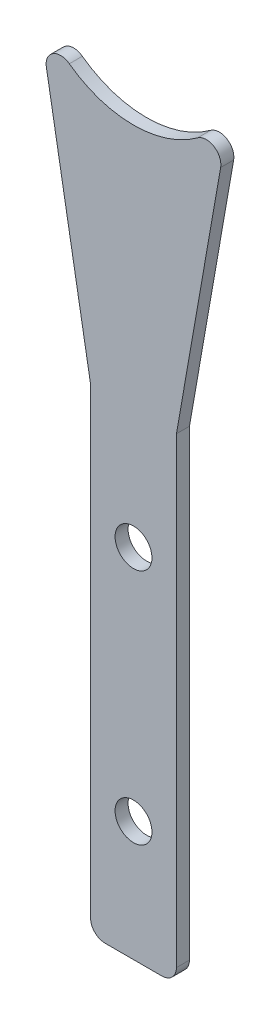
ISO-10303-21;
HEADER;
FILE_DESCRIPTION(('STEP AP214'),'2;1');
FILE_NAME('part.step','',(''),(''),'','','');
FILE_SCHEMA(('AUTOMOTIVE_DESIGN { 1 0 10303 214 1 1 1 1 }'));
ENDSEC;
DATA;
#1=APPLICATION_CONTEXT('core data for automotive mechanical design processes');
#2=APPLICATION_PROTOCOL_DEFINITION('international standard','automotive_design',2000,#1);
#3=PRODUCT_CONTEXT('',#1,'mechanical');
#4=PRODUCT('Part','Part','',(#3));
#5=PRODUCT_RELATED_PRODUCT_CATEGORY('part','',(#4));
#6=PRODUCT_DEFINITION_FORMATION('','',#4);
#7=PRODUCT_DEFINITION_CONTEXT('part definition',#1,'design');
#8=PRODUCT_DEFINITION('design','',#6,#7);
#9=PRODUCT_DEFINITION_SHAPE('','',#8);
#10=(LENGTH_UNIT() NAMED_UNIT(*) SI_UNIT(.MILLI.,.METRE.));
#11=(NAMED_UNIT(*) PLANE_ANGLE_UNIT() SI_UNIT($,.RADIAN.));
#12=(NAMED_UNIT(*) SI_UNIT($,.STERADIAN.) SOLID_ANGLE_UNIT());
#13=UNCERTAINTY_MEASURE_WITH_UNIT(LENGTH_MEASURE(1.E-05),#10,'distance_accuracy_value','');
#14=(GEOMETRIC_REPRESENTATION_CONTEXT(3) GLOBAL_UNCERTAINTY_ASSIGNED_CONTEXT((#13)) GLOBAL_UNIT_ASSIGNED_CONTEXT((#10,
#11,#12)) REPRESENTATION_CONTEXT('',''));
#15=CARTESIAN_POINT('',(0.,0.,0.));
#16=DIRECTION('',(0.,0.,1.));
#17=DIRECTION('',(1.,0.,0.));
#18=AXIS2_PLACEMENT_3D('',#15,#16,#17);
#19=CARTESIAN_POINT('',(-3.07892409853893,0.,1.5875));
#20=DIRECTION('',(-1.,0.,0.));
#21=DIRECTION('',(0.,0.,1.));
#22=AXIS2_PLACEMENT_3D('',#19,#20,#21);
#23=PLANE('',#22);
#24=DIRECTION('',(0.,1.,0.));
#25=VECTOR('',#24,1.);
#26=CARTESIAN_POINT('',(-3.07892409853893,0.,0.));
#27=LINE('',#26,#25);
#28=CARTESIAN_POINT('',(-3.07892409853893,-26.8398665511832,0.));
#29=VERTEX_POINT('',#28);
#30=CARTESIAN_POINT('',(-3.07892409853893,29.5681257650785,0.));
#31=VERTEX_POINT('',#30);
#32=EDGE_CURVE('E148',#29,#31,#27,.T.);
#33=ORIENTED_EDGE('',*,*,#32,.F.);
#34=DIRECTION('',(0.,0.,-1.));
#35=VECTOR('',#34,1.);
#36=CARTESIAN_POINT('',(-3.07892409853893,-26.8398665511832,1.5875));
#37=LINE('',#36,#35);
#38=CARTESIAN_POINT('',(-3.07892409853893,-26.8398665511832,1.5875));
#39=VERTEX_POINT('',#38);
#40=EDGE_CURVE('E185',#29,#39,#37,.F.);
#41=ORIENTED_EDGE('',*,*,#40,.T.);
#42=DIRECTION('',(0.,1.,0.));
#43=VECTOR('',#42,1.);
#44=CARTESIAN_POINT('',(-3.07892409853893,0.,1.5875));
#45=LINE('',#44,#43);
#46=CARTESIAN_POINT('',(-3.07892409853893,29.5681257650785,1.5875));
#47=VERTEX_POINT('',#46);
#48=EDGE_CURVE('E163',#39,#47,#45,.T.);
#49=ORIENTED_EDGE('',*,*,#48,.T.);
#50=DIRECTION('',(0.,0.,-1.));
#51=VECTOR('',#50,1.);
#52=CARTESIAN_POINT('',(-3.07892409853893,29.5681257650785,1.5875));
#53=LINE('',#52,#51);
#54=EDGE_CURVE('E137',#47,#31,#53,.T.);
#55=ORIENTED_EDGE('',*,*,#54,.T.);
#56=EDGE_LOOP('',(#33,#41,#49,#55));
#57=FACE_BOUND('',#56,.T.);
#58=ADVANCED_FACE('F39',(#57),#23,.T.);
#59=CARTESIAN_POINT('',(0.,-28.6178665511832,1.5875));
#60=DIRECTION('',(0.,1.,0.));
#61=DIRECTION('',(0.,0.,1.));
#62=AXIS2_PLACEMENT_3D('',#59,#60,#61);
#63=PLANE('',#62);
#64=DIRECTION('',(1.,0.,0.));
#65=VECTOR('',#64,1.);
#66=CARTESIAN_POINT('',(0.,-28.6178665511832,0.));
#67=LINE('',#66,#65);
#68=CARTESIAN_POINT('',(-1.30092409853893,-28.6178665511832,0.));
#69=VERTEX_POINT('',#68);
#70=CARTESIAN_POINT('',(5.6205080148772,-28.6178665511832,0.));
#71=VERTEX_POINT('',#70);
#72=EDGE_CURVE('E150',#69,#71,#67,.T.);
#73=ORIENTED_EDGE('',*,*,#72,.T.);
#74=DIRECTION('',(0.,0.,-1.));
#75=VECTOR('',#74,1.);
#76=CARTESIAN_POINT('',(5.6205080148772,-28.6178665511832,1.5875));
#77=LINE('',#76,#75);
#78=CARTESIAN_POINT('',(5.6205080148772,-28.6178665511832,1.5875));
#79=VERTEX_POINT('',#78);
#80=EDGE_CURVE('E178',#71,#79,#77,.F.);
#81=ORIENTED_EDGE('',*,*,#80,.T.);
#82=DIRECTION('',(1.,0.,0.));
#83=VECTOR('',#82,1.);
#84=CARTESIAN_POINT('',(0.,-28.6178665511832,1.5875));
#85=LINE('',#84,#83);
#86=CARTESIAN_POINT('',(-1.30092409853893,-28.6178665511832,1.5875));
#87=VERTEX_POINT('',#86);
#88=EDGE_CURVE('E126',#87,#79,#85,.T.);
#89=ORIENTED_EDGE('',*,*,#88,.F.);
#90=DIRECTION('',(0.,0.,-1.));
#91=VECTOR('',#90,1.);
#92=CARTESIAN_POINT('',(-1.30092409853893,-28.6178665511832,0.));
#93=LINE('',#92,#91);
#94=EDGE_CURVE('E175',#87,#69,#93,.T.);
#95=ORIENTED_EDGE('',*,*,#94,.T.);
#96=EDGE_LOOP('',(#73,#81,#89,#95));
#97=FACE_BOUND('',#96,.T.);
#98=ADVANCED_FACE('F218',(#97),#63,.F.);
#99=CARTESIAN_POINT('',(7.3985080148772,0.,1.5875));
#100=DIRECTION('',(-1.,0.,0.));
#101=DIRECTION('',(0.,0.,1.));
#102=AXIS2_PLACEMENT_3D('',#99,#100,#101);
#103=PLANE('',#102);
#104=DIRECTION('',(0.,1.,0.));
#105=VECTOR('',#104,1.);
#106=CARTESIAN_POINT('',(7.3985080148772,0.,1.5875));
#107=LINE('',#106,#105);
#108=CARTESIAN_POINT('',(7.3985080148772,-26.8398665511832,1.5875));
#109=VERTEX_POINT('',#108);
#110=CARTESIAN_POINT('',(7.3985080148772,29.5681257650785,1.5875));
#111=VERTEX_POINT('',#110);
#112=EDGE_CURVE('E115',#109,#111,#107,.T.);
#113=ORIENTED_EDGE('',*,*,#112,.F.);
#114=DIRECTION('',(0.,0.,-1.));
#115=VECTOR('',#114,1.);
#116=CARTESIAN_POINT('',(7.3985080148772,-26.8398665511832,1.5875));
#117=LINE('',#116,#115);
#118=CARTESIAN_POINT('',(7.3985080148772,-26.8398665511832,0.));
#119=VERTEX_POINT('',#118);
#120=EDGE_CURVE('E136',#109,#119,#117,.T.);
#121=ORIENTED_EDGE('',*,*,#120,.T.);
#122=DIRECTION('',(0.,1.,0.));
#123=VECTOR('',#122,1.);
#124=CARTESIAN_POINT('',(7.3985080148772,0.,0.));
#125=LINE('',#124,#123);
#126=CARTESIAN_POINT('',(7.3985080148772,29.5681257650785,0.));
#127=VERTEX_POINT('',#126);
#128=EDGE_CURVE('E132',#119,#127,#125,.T.);
#129=ORIENTED_EDGE('',*,*,#128,.T.);
#130=DIRECTION('',(0.,0.,-1.));
#131=VECTOR('',#130,1.);
#132=CARTESIAN_POINT('',(7.3985080148772,29.5681257650785,1.5875));
#133=LINE('',#132,#131);
#134=EDGE_CURVE('E129',#111,#127,#133,.T.);
#135=ORIENTED_EDGE('',*,*,#134,.F.);
#136=EDGE_LOOP('',(#113,#121,#129,#135));
#137=FACE_BOUND('',#136,.T.);
#138=ADVANCED_FACE('F130',(#137),#103,.F.);
#139=CARTESIAN_POINT('',(2.16060054386414,-0.377913935984634,1.5875));
#140=DIRECTION('',(-0.985045261909091,0.172295768927885,0.));
#141=DIRECTION('',(-0.172295768927885,-0.985045261909091,0.));
#142=AXIS2_PLACEMENT_3D('',#139,#140,#141);
#143=PLANE('',#142);
#144=DIRECTION('',(0.172295768927885,0.985045261909091,0.));
#145=VECTOR('',#144,1.);
#146=CARTESIAN_POINT('',(2.16060054386414,-0.377913935984634,0.));
#147=LINE('',#146,#145);
#148=CARTESIAN_POINT('',(12.791159192441,60.398862495538,0.));
#149=VERTEX_POINT('',#148);
#150=EDGE_CURVE('E155',#127,#149,#147,.T.);
#151=ORIENTED_EDGE('',*,*,#150,.T.);
#152=DIRECTION('',(0.,0.,1.));
#153=VECTOR('',#152,1.);
#154=CARTESIAN_POINT('',(12.791159192441,60.398862495538,1.5875));
#155=LINE('',#154,#153);
#156=CARTESIAN_POINT('',(12.791159192441,60.398862495538,1.5875));
#157=VERTEX_POINT('',#156);
#158=EDGE_CURVE('E11',#149,#157,#155,.T.);
#159=ORIENTED_EDGE('',*,*,#158,.T.);
#160=DIRECTION('',(0.172295768927885,0.985045261909091,0.));
#161=VECTOR('',#160,1.);
#162=CARTESIAN_POINT('',(2.16060054386414,-0.377913935984634,1.5875));
#163=LINE('',#162,#161);
#164=EDGE_CURVE('E120',#111,#157,#163,.T.);
#165=ORIENTED_EDGE('',*,*,#164,.F.);
#166=ORIENTED_EDGE('',*,*,#134,.T.);
#167=EDGE_LOOP('',(#151,#159,#165,#166));
#168=FACE_BOUND('',#167,.T.);
#169=ADVANCED_FACE('F139',(#168),#143,.F.);
#170=CARTESIAN_POINT('',(2.15804198213946,72.7781257043364,1.5875));
#171=DIRECTION('',(0.,0.,-1.));
#172=DIRECTION('',(-1.,0.,0.));
#173=AXIS2_PLACEMENT_3D('',#170,#171,#172);
#174=CYLINDRICAL_SURFACE('',#173,13.21);
#175=CARTESIAN_POINT('',(2.15804198213946,72.7781257043364,0.));
#176=DIRECTION('',(0.,0.,1.));
#177=DIRECTION('',(1.,0.,0.));
#178=AXIS2_PLACEMENT_3D('',#175,#176,#177);
#179=CIRCLE('',#178,13.21);
#180=CARTESIAN_POINT('',(-5.66944118675006,62.1369506169341,0.));
#181=VERTEX_POINT('',#180);
#182=CARTESIAN_POINT('',(9.98612751486066,62.1373937326908,0.));
#183=VERTEX_POINT('',#182);
#184=EDGE_CURVE('E157',#181,#183,#179,.T.);
#185=ORIENTED_EDGE('',*,*,#184,.F.);
#186=DIRECTION('',(0.,0.,-1.));
#187=VECTOR('',#186,1.);
#188=CARTESIAN_POINT('',(-5.66944118675006,62.1369506169341,1.5875));
#189=LINE('',#188,#187);
#190=CARTESIAN_POINT('',(-5.66944118675006,62.1369506169341,1.5875));
#191=VERTEX_POINT('',#190);
#192=EDGE_CURVE('E47',#181,#191,#189,.F.);
#193=ORIENTED_EDGE('',*,*,#192,.T.);
#194=CARTESIAN_POINT('',(2.15804198213946,72.7781257043364,1.5875));
#195=DIRECTION('',(0.,0.,1.));
#196=DIRECTION('',(1.,0.,0.));
#197=AXIS2_PLACEMENT_3D('',#194,#195,#196);
#198=CIRCLE('',#197,13.21);
#199=CARTESIAN_POINT('',(9.98612751486066,62.1373937326908,1.5875));
#200=VERTEX_POINT('',#199);
#201=EDGE_CURVE('E141',#191,#200,#198,.T.);
#202=ORIENTED_EDGE('',*,*,#201,.T.);
#203=DIRECTION('',(0.,0.,-1.));
#204=VECTOR('',#203,1.);
#205=CARTESIAN_POINT('',(9.98612751486066,62.1373937326908,1.5875));
#206=LINE('',#205,#204);
#207=EDGE_CURVE('E190',#200,#183,#206,.T.);
#208=ORIENTED_EDGE('',*,*,#207,.T.);
#209=EDGE_LOOP('',(#185,#193,#202,#208));
#210=FACE_BOUND('',#209,.T.);
#211=ADVANCED_FACE('F195',(#210),#174,.F.);
#212=CARTESIAN_POINT('',(2.03339075524222,0.35585503979909,1.5875));
#213=DIRECTION('',(-0.985029508234318,-0.172385811213273,0.));
#214=DIRECTION('',(0.172385811213273,-0.985029508234318,0.));
#215=AXIS2_PLACEMENT_3D('',#212,#213,#214);
#216=PLANE('',#215);
#217=DIRECTION('',(-0.172385811213273,0.985029508234318,0.));
#218=VECTOR('',#217,1.);
#219=CARTESIAN_POINT('',(2.03339075524222,0.35585503979909,1.5875));
#220=LINE('',#219,#218);
#221=CARTESIAN_POINT('',(-8.47436377913447,60.398199643431,1.5875));
#222=VERTEX_POINT('',#221);
#223=EDGE_CURVE('E143',#47,#222,#220,.T.);
#224=ORIENTED_EDGE('',*,*,#223,.T.);
#225=DIRECTION('',(0.,0.,-1.));
#226=VECTOR('',#225,1.);
#227=CARTESIAN_POINT('',(-8.47436377913447,60.398199643431,1.5875));
#228=LINE('',#227,#226);
#229=CARTESIAN_POINT('',(-8.47436377913447,60.398199643431,0.));
#230=VERTEX_POINT('',#229);
#231=EDGE_CURVE('E187',#222,#230,#228,.T.);
#232=ORIENTED_EDGE('',*,*,#231,.T.);
#233=DIRECTION('',(-0.172385811213273,0.985029508234318,0.));
#234=VECTOR('',#233,1.);
#235=CARTESIAN_POINT('',(2.03339075524222,0.35585503979909,0.));
#236=LINE('',#235,#234);
#237=EDGE_CURVE('E160',#31,#230,#236,.T.);
#238=ORIENTED_EDGE('',*,*,#237,.F.);
#239=ORIENTED_EDGE('',*,*,#54,.F.);
#240=EDGE_LOOP('',(#224,#232,#238,#239));
#241=FACE_BOUND('',#240,.T.);
#242=ADVANCED_FACE('F202',(#241),#216,.T.);
#243=CARTESIAN_POINT('',(0.,0.,1.5875));
#244=DIRECTION('',(0.,0.,1.));
#245=DIRECTION('',(1.,0.,0.));
#246=AXIS2_PLACEMENT_3D('',#243,#244,#245);
#247=PLANE('',#246);
#248=CARTESIAN_POINT('',(2.1599510468991,14.9571257688168,1.5875));
#249=DIRECTION('',(0.,0.,1.));
#250=DIRECTION('',(1.,0.,0.));
#251=AXIS2_PLACEMENT_3D('',#248,#249,#250);
#252=CIRCLE('',#251,2.24999999999999);
#253=CARTESIAN_POINT('',(4.40995104689909,14.9571257688168,1.5875));
#254=VERTEX_POINT('',#253);
#255=EDGE_CURVE('E231',#254,#254,#252,.T.);
#256=ORIENTED_EDGE('',*,*,#255,.F.);
#257=EDGE_LOOP('',(#256));
#258=FACE_BOUND('',#257,.T.);
#259=CARTESIAN_POINT('',(2.15995104689911,-14.0068665511832,1.5875));
#260=DIRECTION('',(0.,0.,1.));
#261=DIRECTION('',(1.,0.,0.));
#262=AXIS2_PLACEMENT_3D('',#259,#260,#261);
#263=CIRCLE('',#262,2.24999999999999);
#264=CARTESIAN_POINT('',(4.4099510468991,-14.0068665511832,1.5875));
#265=VERTEX_POINT('',#264);
#266=EDGE_CURVE('E225',#265,#265,#263,.T.);
#267=ORIENTED_EDGE('',*,*,#266,.F.);
#268=EDGE_LOOP('',(#267));
#269=FACE_BOUND('',#268,.T.);
#270=ORIENTED_EDGE('',*,*,#88,.T.);
#271=CARTESIAN_POINT('',(5.6205080148772,-26.8398665511832,1.5875));
#272=DIRECTION('',(0.,0.,1.));
#273=DIRECTION('',(1.,0.,0.));
#274=AXIS2_PLACEMENT_3D('',#271,#272,#273);
#275=CIRCLE('',#274,1.778);
#276=EDGE_CURVE('E122',#79,#109,#275,.T.);
#277=ORIENTED_EDGE('',*,*,#276,.T.);
#278=ORIENTED_EDGE('',*,*,#112,.T.);
#279=ORIENTED_EDGE('',*,*,#164,.T.);
#280=CARTESIAN_POINT('',(11.0397487167667,60.7052043726918,1.5875));
#281=DIRECTION('',(0.,0.,1.));
#282=DIRECTION('',(1.,0.,0.));
#283=AXIS2_PLACEMENT_3D('',#280,#281,#282);
#284=CIRCLE('',#283,1.778);
#285=EDGE_CURVE('E60',#157,#200,#284,.T.);
#286=ORIENTED_EDGE('',*,*,#285,.T.);
#287=ORIENTED_EDGE('',*,*,#201,.F.);
#288=CARTESIAN_POINT('',(-6.72298131349385,60.7047016157682,1.5875));
#289=DIRECTION('',(0.,0.,1.));
#290=DIRECTION('',(1.,0.,0.));
#291=AXIS2_PLACEMENT_3D('',#288,#289,#290);
#292=CIRCLE('',#291,1.778);
#293=EDGE_CURVE('E54',#191,#222,#292,.T.);
#294=ORIENTED_EDGE('',*,*,#293,.T.);
#295=ORIENTED_EDGE('',*,*,#223,.F.);
#296=ORIENTED_EDGE('',*,*,#48,.F.);
#297=CARTESIAN_POINT('',(-1.30092409853893,-26.8398665511832,1.5875));
#298=DIRECTION('',(0.,0.,1.));
#299=DIRECTION('',(1.,0.,0.));
#300=AXIS2_PLACEMENT_3D('',#297,#298,#299);
#301=CIRCLE('',#300,1.778);
#302=EDGE_CURVE('E182',#39,#87,#301,.T.);
#303=ORIENTED_EDGE('',*,*,#302,.T.);
#304=EDGE_LOOP('',(#270,#277,#278,#279,#286,#287,#294,#295,#296,#303));
#305=FACE_BOUND('',#304,.T.);
#306=ADVANCED_FACE('F118',(#258,#269,#305),#247,.T.);
#307=CARTESIAN_POINT('',(0.,0.,0.));
#308=DIRECTION('',(0.,0.,1.));
#309=DIRECTION('',(1.,0.,0.));
#310=AXIS2_PLACEMENT_3D('',#307,#308,#309);
#311=PLANE('',#310);
#312=CARTESIAN_POINT('',(2.1599510468991,14.9571257688168,0.));
#313=DIRECTION('',(0.,0.,1.));
#314=DIRECTION('',(1.,0.,0.));
#315=AXIS2_PLACEMENT_3D('',#312,#313,#314);
#316=CIRCLE('',#315,2.25);
#317=CARTESIAN_POINT('',(4.4099510468991,14.9571257688168,0.));
#318=VERTEX_POINT('',#317);
#319=EDGE_CURVE('E228',#318,#318,#316,.T.);
#320=ORIENTED_EDGE('',*,*,#319,.T.);
#321=EDGE_LOOP('',(#320));
#322=FACE_BOUND('',#321,.T.);
#323=CARTESIAN_POINT('',(2.15995104689911,-14.0068665511832,0.));
#324=DIRECTION('',(0.,0.,1.));
#325=DIRECTION('',(1.,0.,0.));
#326=AXIS2_PLACEMENT_3D('',#323,#324,#325);
#327=CIRCLE('',#326,2.25);
#328=CARTESIAN_POINT('',(4.40995104689911,-14.0068665511832,0.));
#329=VERTEX_POINT('',#328);
#330=EDGE_CURVE('E151',#329,#329,#327,.T.);
#331=ORIENTED_EDGE('',*,*,#330,.T.);
#332=EDGE_LOOP('',(#331));
#333=FACE_BOUND('',#332,.T.);
#334=ORIENTED_EDGE('',*,*,#128,.F.);
#335=CARTESIAN_POINT('',(5.6205080148772,-26.8398665511832,0.));
#336=DIRECTION('',(0.,0.,1.));
#337=DIRECTION('',(1.,0.,0.));
#338=AXIS2_PLACEMENT_3D('',#335,#336,#337);
#339=CIRCLE('',#338,1.778);
#340=EDGE_CURVE('E173',#119,#71,#339,.F.);
#341=ORIENTED_EDGE('',*,*,#340,.T.);
#342=ORIENTED_EDGE('',*,*,#72,.F.);
#343=CARTESIAN_POINT('',(-1.30092409853893,-26.8398665511832,0.));
#344=DIRECTION('',(0.,0.,1.));
#345=DIRECTION('',(1.,0.,0.));
#346=AXIS2_PLACEMENT_3D('',#343,#344,#345);
#347=CIRCLE('',#346,1.778);
#348=EDGE_CURVE('E171',#69,#29,#347,.F.);
#349=ORIENTED_EDGE('',*,*,#348,.T.);
#350=ORIENTED_EDGE('',*,*,#32,.T.);
#351=ORIENTED_EDGE('',*,*,#237,.T.);
#352=CARTESIAN_POINT('',(-6.72298131349385,60.7047016157682,0.));
#353=DIRECTION('',(0.,0.,1.));
#354=DIRECTION('',(1.,0.,0.));
#355=AXIS2_PLACEMENT_3D('',#352,#353,#354);
#356=CIRCLE('',#355,1.778);
#357=EDGE_CURVE('E169',#230,#181,#356,.F.);
#358=ORIENTED_EDGE('',*,*,#357,.T.);
#359=ORIENTED_EDGE('',*,*,#184,.T.);
#360=CARTESIAN_POINT('',(11.0397487167667,60.7052043726918,0.));
#361=DIRECTION('',(0.,0.,1.));
#362=DIRECTION('',(1.,0.,0.));
#363=AXIS2_PLACEMENT_3D('',#360,#361,#362);
#364=CIRCLE('',#363,1.778);
#365=EDGE_CURVE('E167',#183,#149,#364,.F.);
#366=ORIENTED_EDGE('',*,*,#365,.T.);
#367=ORIENTED_EDGE('',*,*,#150,.F.);
#368=EDGE_LOOP('',(#334,#341,#342,#349,#350,#351,#358,#359,#366,#367));
#369=FACE_BOUND('',#368,.T.);
#370=ADVANCED_FACE('F205',(#322,#333,#369),#311,.F.);
#371=CARTESIAN_POINT('',(5.6205080148772,-26.8398665511832,1.5875));
#372=DIRECTION('',(0.,0.,-1.));
#373=DIRECTION('',(-1.,0.,0.));
#374=AXIS2_PLACEMENT_3D('',#371,#372,#373);
#375=CYLINDRICAL_SURFACE('',#374,1.778);
#376=ORIENTED_EDGE('',*,*,#276,.F.);
#377=ORIENTED_EDGE('',*,*,#80,.F.);
#378=ORIENTED_EDGE('',*,*,#340,.F.);
#379=ORIENTED_EDGE('',*,*,#120,.F.);
#380=EDGE_LOOP('',(#376,#377,#378,#379));
#381=FACE_BOUND('',#380,.T.);
#382=ADVANCED_FACE('F221',(#381),#375,.T.);
#383=CARTESIAN_POINT('',(-1.30092409853893,-26.8398665511832,1.5875));
#384=DIRECTION('',(0.,0.,1.));
#385=DIRECTION('',(1.,0.,0.));
#386=AXIS2_PLACEMENT_3D('',#383,#384,#385);
#387=CYLINDRICAL_SURFACE('',#386,1.778);
#388=ORIENTED_EDGE('',*,*,#302,.F.);
#389=ORIENTED_EDGE('',*,*,#40,.F.);
#390=ORIENTED_EDGE('',*,*,#348,.F.);
#391=ORIENTED_EDGE('',*,*,#94,.F.);
#392=EDGE_LOOP('',(#388,#389,#390,#391));
#393=FACE_BOUND('',#392,.T.);
#394=ADVANCED_FACE('F216',(#393),#387,.T.);
#395=CARTESIAN_POINT('',(-6.72298131349385,60.7047016157682,1.5875));
#396=DIRECTION('',(0.,0.,-1.));
#397=DIRECTION('',(-1.,0.,0.));
#398=AXIS2_PLACEMENT_3D('',#395,#396,#397);
#399=CYLINDRICAL_SURFACE('',#398,1.778);
#400=ORIENTED_EDGE('',*,*,#293,.F.);
#401=ORIENTED_EDGE('',*,*,#192,.F.);
#402=ORIENTED_EDGE('',*,*,#357,.F.);
#403=ORIENTED_EDGE('',*,*,#231,.F.);
#404=EDGE_LOOP('',(#400,#401,#402,#403));
#405=FACE_BOUND('',#404,.T.);
#406=ADVANCED_FACE('F199',(#405),#399,.T.);
#407=CARTESIAN_POINT('',(11.0397487167667,60.7052043726918,1.5875));
#408=DIRECTION('',(0.,0.,-1.));
#409=DIRECTION('',(-1.,0.,0.));
#410=AXIS2_PLACEMENT_3D('',#407,#408,#409);
#411=CYLINDRICAL_SURFACE('',#410,1.778);
#412=ORIENTED_EDGE('',*,*,#285,.F.);
#413=ORIENTED_EDGE('',*,*,#158,.F.);
#414=ORIENTED_EDGE('',*,*,#365,.F.);
#415=ORIENTED_EDGE('',*,*,#207,.F.);
#416=EDGE_LOOP('',(#412,#413,#414,#415));
#417=FACE_BOUND('',#416,.T.);
#418=ADVANCED_FACE('F41',(#417),#411,.T.);
#419=CARTESIAN_POINT('',(2.15995104689911,-14.0068665511832,1.5875));
#420=DIRECTION('',(0.,0.,1.));
#421=DIRECTION('',(1.,0.,0.));
#422=AXIS2_PLACEMENT_3D('',#419,#420,#421);
#423=CYLINDRICAL_SURFACE('',#422,2.24999999999999);
#424=ORIENTED_EDGE('',*,*,#330,.F.);
#425=EDGE_LOOP('',(#424));
#426=FACE_BOUND('',#425,.T.);
#427=ORIENTED_EDGE('',*,*,#266,.T.);
#428=EDGE_LOOP('',(#427));
#429=FACE_BOUND('',#428,.T.);
#430=ADVANCED_FACE('F242',(#426,#429),#423,.F.);
#431=CARTESIAN_POINT('',(2.1599510468991,14.9571257688168,1.5875));
#432=DIRECTION('',(0.,0.,1.));
#433=DIRECTION('',(1.,0.,0.));
#434=AXIS2_PLACEMENT_3D('',#431,#432,#433);
#435=CYLINDRICAL_SURFACE('',#434,2.24999999999999);
#436=ORIENTED_EDGE('',*,*,#319,.F.);
#437=EDGE_LOOP('',(#436));
#438=FACE_BOUND('',#437,.T.);
#439=ORIENTED_EDGE('',*,*,#255,.T.);
#440=EDGE_LOOP('',(#439));
#441=FACE_BOUND('',#440,.T.);
#442=ADVANCED_FACE('F235',(#438,#441),#435,.F.);
#443=CLOSED_SHELL('',(#58,#98,#138,#169,#211,#242,#306,#370,#382,#394,#406,#418,#430,#442));
#444=MANIFOLD_SOLID_BREP('B2',#443);
#445=ADVANCED_BREP_SHAPE_REPRESENTATION('',(#18,#444),#14);
#446=SHAPE_DEFINITION_REPRESENTATION(#9,#445);
ENDSEC;
END-ISO-10303-21;
